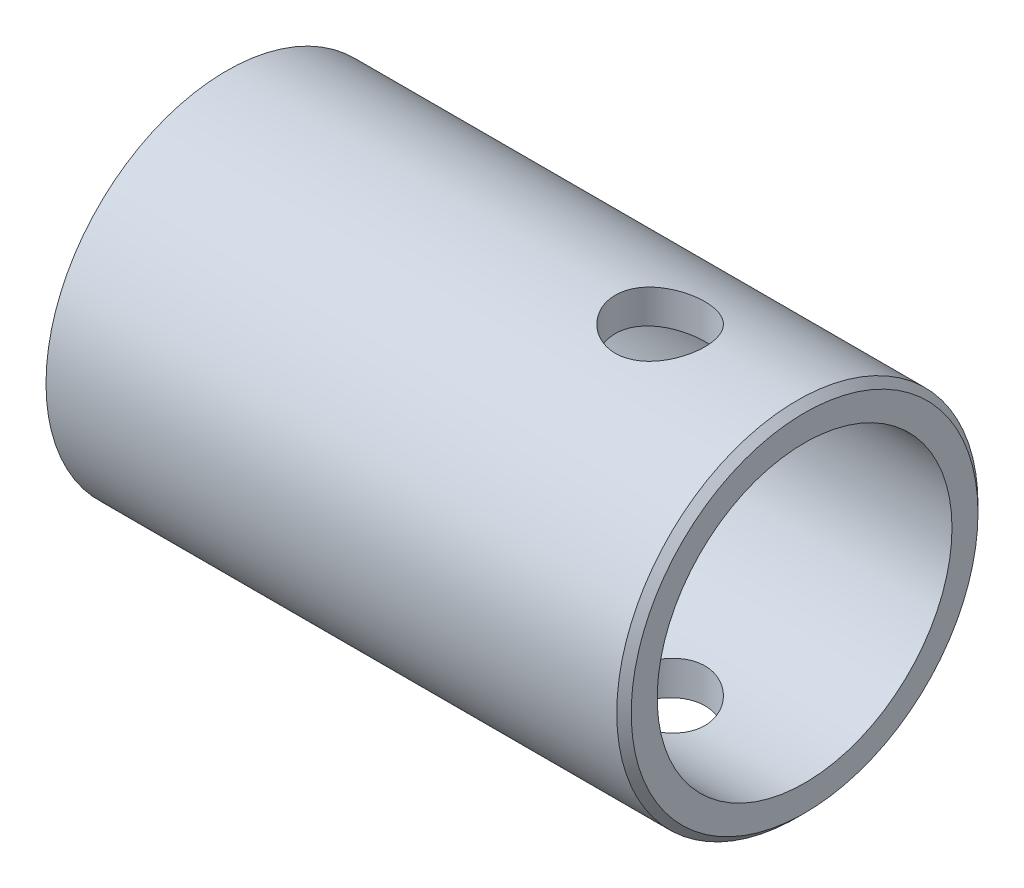
ISO-10303-21;
HEADER;
FILE_DESCRIPTION(('STEP AP214'),'2;1');
FILE_NAME('part.step','',(''),(''),'','','');
FILE_SCHEMA(('AUTOMOTIVE_DESIGN { 1 0 10303 214 1 1 1 1 }'));
ENDSEC;
DATA;
#1=APPLICATION_CONTEXT('core data for automotive mechanical design processes');
#2=APPLICATION_PROTOCOL_DEFINITION('international standard','automotive_design',2000,#1);
#3=PRODUCT_CONTEXT('',#1,'mechanical');
#4=PRODUCT('Part','Part','',(#3));
#5=PRODUCT_RELATED_PRODUCT_CATEGORY('part','',(#4));
#6=PRODUCT_DEFINITION_FORMATION('','',#4);
#7=PRODUCT_DEFINITION_CONTEXT('part definition',#1,'design');
#8=PRODUCT_DEFINITION('design','',#6,#7);
#9=PRODUCT_DEFINITION_SHAPE('','',#8);
#10=(LENGTH_UNIT() NAMED_UNIT(*) SI_UNIT(.MILLI.,.METRE.));
#11=(NAMED_UNIT(*) PLANE_ANGLE_UNIT() SI_UNIT($,.RADIAN.));
#12=(NAMED_UNIT(*) SI_UNIT($,.STERADIAN.) SOLID_ANGLE_UNIT());
#13=UNCERTAINTY_MEASURE_WITH_UNIT(LENGTH_MEASURE(1.E-05),#10,'distance_accuracy_value','');
#14=(GEOMETRIC_REPRESENTATION_CONTEXT(3) GLOBAL_UNCERTAINTY_ASSIGNED_CONTEXT((#13)) GLOBAL_UNIT_ASSIGNED_CONTEXT((#10,
#11,#12)) REPRESENTATION_CONTEXT('',''));
#15=CARTESIAN_POINT('',(0.,0.,0.));
#16=DIRECTION('',(0.,0.,1.));
#17=DIRECTION('',(1.,0.,0.));
#18=AXIS2_PLACEMENT_3D('',#15,#16,#17);
#19=CARTESIAN_POINT('',(30.,0.,0.));
#20=DIRECTION('',(1.,0.,0.));
#21=DIRECTION('',(0.,0.,-1.));
#22=AXIS2_PLACEMENT_3D('',#19,#20,#21);
#23=PLANE('',#22);
#24=CARTESIAN_POINT('',(30.,0.,0.));
#25=DIRECTION('',(1.,0.,0.));
#26=DIRECTION('',(0.,0.,-1.));
#27=AXIS2_PLACEMENT_3D('',#24,#25,#26);
#28=CIRCLE('',#27,12.);
#29=CARTESIAN_POINT('',(30.,0.,-12.));
#30=VERTEX_POINT('',#29);
#31=EDGE_CURVE('E47',#30,#30,#28,.T.);
#32=ORIENTED_EDGE('',*,*,#31,.T.);
#33=EDGE_LOOP('',(#32));
#34=FACE_BOUND('',#33,.T.);
#35=CARTESIAN_POINT('',(30.,0.,0.));
#36=DIRECTION('',(1.,0.,0.));
#37=DIRECTION('',(0.,0.,-1.));
#38=AXIS2_PLACEMENT_3D('',#35,#36,#37);
#39=CIRCLE('',#38,10.2);
#40=CARTESIAN_POINT('',(30.,0.,-10.2));
#41=VERTEX_POINT('',#40);
#42=EDGE_CURVE('E52',#41,#41,#39,.T.);
#43=ORIENTED_EDGE('',*,*,#42,.F.);
#44=EDGE_LOOP('',(#43));
#45=FACE_BOUND('',#44,.T.);
#46=ADVANCED_FACE('F38',(#34,#45),#23,.T.);
#47=CARTESIAN_POINT('',(30.,0.,0.));
#48=DIRECTION('',(-1.,0.,0.));
#49=DIRECTION('',(0.,0.,1.));
#50=AXIS2_PLACEMENT_3D('',#47,#48,#49);
#51=CYLINDRICAL_SURFACE('',#50,12.5);
#52=CARTESIAN_POINT('',(29.5,0.,0.));
#53=DIRECTION('',(1.,0.,0.));
#54=DIRECTION('',(0.,0.,-1.));
#55=AXIS2_PLACEMENT_3D('',#52,#53,#54);
#56=CIRCLE('',#55,12.5);
#57=CARTESIAN_POINT('',(29.5,0.,-12.5));
#58=VERTEX_POINT('',#57);
#59=EDGE_CURVE('E10',#58,#58,#56,.F.);
#60=ORIENTED_EDGE('',*,*,#59,.T.);
#61=EDGE_LOOP('',(#60));
#62=FACE_BOUND('',#61,.T.);
#63=CARTESIAN_POINT('',(20.,-12.1095004025765,3.1));
#64=CARTESIAN_POINT('',(20.171230306462,-12.1095036969281,3.09999505768814));
#65=CARTESIAN_POINT('',(20.3425156024854,-12.113171892604,3.0857646710192));
#66=CARTESIAN_POINT('',(20.680170676613,-12.1274115812828,3.02930792139365));
#67=CARTESIAN_POINT('',(20.8465374867954,-12.1379871569294,2.98706500125337));
#68=CARTESIAN_POINT('',(21.1694227484503,-12.1647718569959,2.87603182358399));
#69=CARTESIAN_POINT('',(21.3259534870951,-12.1809737808694,2.80727548531038));
#70=CARTESIAN_POINT('',(21.6252744434348,-12.2171766879529,2.64527013145648));
#71=CARTESIAN_POINT('',(21.7680641347064,-12.2371778166242,2.55202017802905));
#72=CARTESIAN_POINT('',(22.0389423724172,-12.2792103914624,2.34151763869703));
#73=CARTESIAN_POINT('',(22.1666894652632,-12.3012738533202,2.22383197210292));
#74=CARTESIAN_POINT('',(22.4008492975071,-12.3446671989235,1.96873164115792));
#75=CARTESIAN_POINT('',(22.5072600665424,-12.3659970147677,1.83131515671836));
#76=CARTESIAN_POINT('',(22.6971205269653,-12.4058736259303,1.53831806708502));
#77=CARTESIAN_POINT('',(22.7802352519266,-12.4243782348496,1.38251416735298));
#78=CARTESIAN_POINT('',(22.9189670617538,-12.45615445694,1.05861118609272));
#79=CARTESIAN_POINT('',(22.974588137091,-12.4694268294694,0.890513892914921));
#80=CARTESIAN_POINT('',(23.0556614098036,-12.4890168188816,0.550354880943367));
#81=CARTESIAN_POINT('',(23.0816933268929,-12.4954678979263,0.378439150973423));
#82=CARTESIAN_POINT('',(23.1046685547131,-12.5011533404126,0.0325677497739097));
#83=CARTESIAN_POINT('',(23.1016161002728,-12.5003887544908,-0.141387620789995));
#84=CARTESIAN_POINT('',(23.0669271831509,-12.491828543349,-0.482381309338295));
#85=CARTESIAN_POINT('',(23.035916409909,-12.4841868305697,-0.649487722523164));
#86=CARTESIAN_POINT('',(22.9471962690822,-12.46290994108,-0.976046857571029));
#87=CARTESIAN_POINT('',(22.8894854930732,-12.4492744482,-1.13549917519097));
#88=CARTESIAN_POINT('',(22.7484941549075,-12.4173058251709,-1.44387823753698));
#89=CARTESIAN_POINT('',(22.6649899513674,-12.3989318496651,-1.59269832497694));
#90=CARTESIAN_POINT('',(22.4749515796042,-12.3594808408466,-1.87443320726067));
#91=CARTESIAN_POINT('',(22.3684134618889,-12.3384033442292,-2.00734526836763));
#92=CARTESIAN_POINT('',(22.1319737177313,-12.2951809865875,-2.25722217074307));
#93=CARTESIAN_POINT('',(22.0015252585027,-12.273022649575,-2.37366780241004));
#94=CARTESIAN_POINT('',(21.7227203737036,-12.2306506575257,-2.58314513243327));
#95=CARTESIAN_POINT('',(21.5743631387264,-12.2104370904591,-2.67617577193683));
#96=CARTESIAN_POINT('',(21.2629457870134,-12.1741958121655,-2.83650766352277));
#97=CARTESIAN_POINT('',(21.0998197580579,-12.1581882492215,-2.90368576073025));
#98=CARTESIAN_POINT('',(20.7640969614249,-12.1324310431632,-3.00950411184579));
#99=CARTESIAN_POINT('',(20.5915021920375,-12.1226800851231,-3.0481503624364));
#100=CARTESIAN_POINT('',(20.2465515431067,-12.1108156045406,-3.09495038529759));
#101=CARTESIAN_POINT('',(20.0743061910669,-12.1085100476246,-3.10387104764719));
#102=CARTESIAN_POINT('',(19.7307878888389,-12.1112750116352,-3.09306462115271));
#103=CARTESIAN_POINT('',(19.5595148521278,-12.1163448655851,-3.0733401227621));
#104=CARTESIAN_POINT('',(19.2256385185535,-12.1331055651513,-3.00647524657814));
#105=CARTESIAN_POINT('',(19.062940221908,-12.1446889002202,-2.95977971682027));
#106=CARTESIAN_POINT('',(18.7476802854728,-12.1730696846342,-2.84079072403559));
#107=CARTESIAN_POINT('',(18.5951198341489,-12.1898677439998,-2.76849426606215));
#108=CARTESIAN_POINT('',(18.30121216457,-12.227190762839,-2.59874483399771));
#109=CARTESIAN_POINT('',(18.1601388421621,-12.2477815118928,-2.50083241499443));
#110=CARTESIAN_POINT('',(17.8961431000053,-12.2902076501179,-2.2832127230848));
#111=CARTESIAN_POINT('',(17.7732236192799,-12.312043240032,-2.16350192811128));
#112=CARTESIAN_POINT('',(17.5459270697073,-12.3551483638611,-1.90216739414241));
#113=CARTESIAN_POINT('',(17.44208000408,-12.3763907938598,-1.76007738379077));
#114=CARTESIAN_POINT('',(17.2597213765469,-12.4153600241027,-1.46002997317109));
#115=CARTESIAN_POINT('',(17.1812084989043,-12.433087006904,-1.30207339749569));
#116=CARTESIAN_POINT('',(17.0524231663454,-12.462916765785,-0.975863817826879));
#117=CARTESIAN_POINT('',(17.0019488134661,-12.4750596394128,-0.807694361232425));
#118=CARTESIAN_POINT('',(16.9300652646458,-12.4925284130761,-0.464919820973038));
#119=CARTESIAN_POINT('',(16.9086505547465,-12.4978556063505,-0.290315964671496));
#120=CARTESIAN_POINT('',(16.8958001968035,-12.5010409712553,0.0553885048222954));
#121=CARTESIAN_POINT('',(16.9035817994089,-12.4990941637902,0.226458669550183));
#122=CARTESIAN_POINT('',(16.9471131547232,-12.4883817501128,0.564772935581729));
#123=CARTESIAN_POINT('',(16.9828620997699,-12.4796163408133,0.732017147230613));
#124=CARTESIAN_POINT('',(17.0808963609403,-12.4562807426228,1.05712708868771));
#125=CARTESIAN_POINT('',(17.143042171491,-12.4417410960694,1.21503722032818));
#126=CARTESIAN_POINT('',(17.2919791088261,-12.408389450099,1.5182779557583));
#127=CARTESIAN_POINT('',(17.3787732986025,-12.3895769197597,1.66360699319651));
#128=CARTESIAN_POINT('',(17.5769416310554,-12.349154005666,1.94127913496442));
#129=CARTESIAN_POINT('',(17.6888482080386,-12.3274880062304,2.07323416167502));
#130=CARTESIAN_POINT('',(17.9330282087782,-12.2840533133329,2.31675830908232));
#131=CARTESIAN_POINT('',(18.0653067679012,-12.2622845953226,2.42832227405311));
#132=CARTESIAN_POINT('',(18.3493866550678,-12.2206567681472,2.62989744091099));
#133=CARTESIAN_POINT('',(18.5015006653637,-12.2008398423108,2.71947736424201));
#134=CARTESIAN_POINT('',(18.8190982604266,-12.1659242019711,2.87165936643607));
#135=CARTESIAN_POINT('',(18.9845719000728,-12.1508220177641,2.93428129732557));
#136=CARTESIAN_POINT('',(19.2914904014501,-12.1294359406737,3.02131889679248));
#137=CARTESIAN_POINT('',(19.4314519239201,-12.1220159040622,3.05076054128116));
#138=CARTESIAN_POINT('',(19.7142630261312,-12.1120469610578,3.09010235036591));
#139=CARTESIAN_POINT('',(19.8571123670558,-12.1094976535181,3.10000412424213));
#140=CARTESIAN_POINT('',(20.,-12.1095004025765,3.1));
#141=B_SPLINE_CURVE_WITH_KNOTS('',3,(#63,#64,#65,#66,#67,#68,#69,#70,#71,#72,#73,#74,#75,#76,
#77,#78,#79,#80,#81,#82,#83,#84,#85,#86,#87,#88,#89,#90,#91,#92,#93,#94,#95,#96,#97,#98,#99,
#100,#101,#102,#103,#104,#105,#106,#107,#108,#109,#110,#111,#112,#113,#114,#115,#116,#117,#118,
#119,#120,#121,#122,#123,#124,#125,#126,#127,#128,#129,#130,#131,#132,#133,#134,#135,#136,#137,
#138,#139,#140),.UNSPECIFIED.,.T.,.F.,(4,2,2,2,2,2,2,2,2,2,2,2,2,2,2,2,2,2,2,2,2,2,2,2,2,2,2,2,
2,2,2,2,2,2,2,2,2,2,4),(0.,0.513166266797631,1.02663611807438,1.53945124271708,2.0522860056336,
2.57513332734764,3.09802891064934,3.62809679991228,4.1580877316852,4.67750557333038,
5.19684778631792,5.70484831185399,6.212875637454,6.72543768722411,7.23808769284673,
7.76439579336746,8.29072768986715,8.819536743264,9.34823462252216,9.86318244943826,
10.3780837112355,10.8847255422946,11.391426662876,11.9079264617309,12.4245097880824,
12.9537900115952,13.4830427423909,14.0084333575632,14.5337242678862,15.0450340887744,
15.5563291442148,16.0649550187847,16.573644126689,17.094355393731,17.6151981371013,
18.1455621705257,18.6755349698102,19.1037953309693,19.5320204196499),.UNSPECIFIED.);
#142=CARTESIAN_POINT('',(20.,-12.1095004025765,3.1));
#143=VERTEX_POINT('',#142);
#144=EDGE_CURVE('E98',#143,#143,#141,.T.);
#145=ORIENTED_EDGE('',*,*,#144,.T.);
#146=EDGE_LOOP('',(#145));
#147=FACE_BOUND('',#146,.T.);
#148=CARTESIAN_POINT('',(20.,12.1095004025765,3.1));
#149=CARTESIAN_POINT('',(19.828769693538,12.1095036969281,3.09999505768814));
#150=CARTESIAN_POINT('',(19.6574843975146,12.113171892604,3.0857646710192));
#151=CARTESIAN_POINT('',(19.3198293233869,12.1274115812828,3.02930792139365));
#152=CARTESIAN_POINT('',(19.1534625132046,12.1379871569294,2.98706500125337));
#153=CARTESIAN_POINT('',(18.8305772515497,12.1647718569959,2.87603182358399));
#154=CARTESIAN_POINT('',(18.6740465129049,12.1809737808694,2.80727548531038));
#155=CARTESIAN_POINT('',(18.3747255565652,12.2171766879529,2.64527013145648));
#156=CARTESIAN_POINT('',(18.2319358652936,12.2371778166242,2.55202017802905));
#157=CARTESIAN_POINT('',(17.9610576275828,12.2792103914624,2.34151763869703));
#158=CARTESIAN_POINT('',(17.8333105347368,12.3012738533202,2.22383197210292));
#159=CARTESIAN_POINT('',(17.5991507024929,12.3446671989235,1.96873164115792));
#160=CARTESIAN_POINT('',(17.4927399334576,12.3659970147677,1.83131515671836));
#161=CARTESIAN_POINT('',(17.3028794730347,12.4058736259303,1.53831806708502));
#162=CARTESIAN_POINT('',(17.2197647480734,12.4243782348496,1.38251416735298));
#163=CARTESIAN_POINT('',(17.0810329382462,12.45615445694,1.05861118609272));
#164=CARTESIAN_POINT('',(17.025411862909,12.4694268294694,0.890513892914921));
#165=CARTESIAN_POINT('',(16.9443385901964,12.4890168188816,0.550354880943367));
#166=CARTESIAN_POINT('',(16.9183066731071,12.4954678979263,0.378439150973423));
#167=CARTESIAN_POINT('',(16.8953314452869,12.5011533404126,0.0325677497739097));
#168=CARTESIAN_POINT('',(16.8983838997272,12.5003887544908,-0.141387620789995));
#169=CARTESIAN_POINT('',(16.9330728168491,12.491828543349,-0.482381309338295));
#170=CARTESIAN_POINT('',(16.964083590091,12.4841868305697,-0.649487722523164));
#171=CARTESIAN_POINT('',(17.0528037309178,12.46290994108,-0.976046857571029));
#172=CARTESIAN_POINT('',(17.1105145069268,12.4492744482,-1.13549917519097));
#173=CARTESIAN_POINT('',(17.2515058450925,12.4173058251709,-1.44387823753698));
#174=CARTESIAN_POINT('',(17.3350100486326,12.3989318496651,-1.59269832497694));
#175=CARTESIAN_POINT('',(17.5250484203958,12.3594808408466,-1.87443320726068));
#176=CARTESIAN_POINT('',(17.6315865381111,12.3384033442292,-2.00734526836763));
#177=CARTESIAN_POINT('',(17.8680262822687,12.2951809865875,-2.25722217074307));
#178=CARTESIAN_POINT('',(17.9984747414973,12.273022649575,-2.37366780241004));
#179=CARTESIAN_POINT('',(18.2772796262964,12.2306506575257,-2.58314513243327));
#180=CARTESIAN_POINT('',(18.4256368612736,12.2104370904591,-2.67617577193683));
#181=CARTESIAN_POINT('',(18.7370542129866,12.1741958121655,-2.83650766352277));
#182=CARTESIAN_POINT('',(18.9001802419421,12.1581882492215,-2.90368576073025));
#183=CARTESIAN_POINT('',(19.2359030385751,12.1324310431632,-3.0095041118458));
#184=CARTESIAN_POINT('',(19.4084978079625,12.1226800851231,-3.0481503624364));
#185=CARTESIAN_POINT('',(19.7534484568933,12.1108156045406,-3.09495038529759));
#186=CARTESIAN_POINT('',(19.9256938089331,12.1085100476246,-3.10387104764719));
#187=CARTESIAN_POINT('',(20.2692121111611,12.1112750116352,-3.09306462115271));
#188=CARTESIAN_POINT('',(20.4404851478722,12.1163448655851,-3.0733401227621));
#189=CARTESIAN_POINT('',(20.7743614814465,12.1331055651513,-3.00647524657814));
#190=CARTESIAN_POINT('',(20.937059778092,12.1446889002202,-2.95977971682027));
#191=CARTESIAN_POINT('',(21.2523197145271,12.1730696846342,-2.84079072403559));
#192=CARTESIAN_POINT('',(21.4048801658511,12.1898677439998,-2.76849426606215));
#193=CARTESIAN_POINT('',(21.69878783543,12.227190762839,-2.59874483399771));
#194=CARTESIAN_POINT('',(21.8398611578379,12.2477815118928,-2.50083241499443));
#195=CARTESIAN_POINT('',(22.1038568999947,12.2902076501179,-2.2832127230848));
#196=CARTESIAN_POINT('',(22.2267763807201,12.312043240032,-2.16350192811128));
#197=CARTESIAN_POINT('',(22.4540729302927,12.3551483638611,-1.90216739414241));
#198=CARTESIAN_POINT('',(22.55791999592,12.3763907938598,-1.76007738379077));
#199=CARTESIAN_POINT('',(22.7402786234531,12.4153600241027,-1.46002997317109));
#200=CARTESIAN_POINT('',(22.8187915010957,12.433087006904,-1.30207339749569));
#201=CARTESIAN_POINT('',(22.9475768336546,12.462916765785,-0.975863817826879));
#202=CARTESIAN_POINT('',(22.9980511865339,12.4750596394128,-0.807694361232425));
#203=CARTESIAN_POINT('',(23.0699347353542,12.4925284130761,-0.464919820973038));
#204=CARTESIAN_POINT('',(23.0913494452535,12.4978556063505,-0.290315964671496));
#205=CARTESIAN_POINT('',(23.1041998031965,12.5010409712553,0.0553885048222954));
#206=CARTESIAN_POINT('',(23.0964182005911,12.4990941637902,0.226458669550183));
#207=CARTESIAN_POINT('',(23.0528868452768,12.4883817501128,0.564772935581729));
#208=CARTESIAN_POINT('',(23.0171379002301,12.4796163408133,0.732017147230613));
#209=CARTESIAN_POINT('',(22.9191036390597,12.4562807426228,1.05712708868771));
#210=CARTESIAN_POINT('',(22.856957828509,12.4417410960694,1.21503722032818));
#211=CARTESIAN_POINT('',(22.7080208911739,12.408389450099,1.5182779557583));
#212=CARTESIAN_POINT('',(22.6212267013975,12.3895769197597,1.66360699319651));
#213=CARTESIAN_POINT('',(22.4230583689446,12.349154005666,1.94127913496442));
#214=CARTESIAN_POINT('',(22.3111517919614,12.3274880062304,2.07323416167502));
#215=CARTESIAN_POINT('',(22.0669717912218,12.2840533133329,2.31675830908232));
#216=CARTESIAN_POINT('',(21.9346932320988,12.2622845953226,2.42832227405311));
#217=CARTESIAN_POINT('',(21.6506133449322,12.2206567681472,2.62989744091099));
#218=CARTESIAN_POINT('',(21.4984993346363,12.2008398423108,2.71947736424201));
#219=CARTESIAN_POINT('',(21.1809017395734,12.1659242019711,2.87165936643607));
#220=CARTESIAN_POINT('',(21.0154280999272,12.1508220177641,2.93428129732557));
#221=CARTESIAN_POINT('',(20.7085095985499,12.1294359406737,3.02131889679248));
#222=CARTESIAN_POINT('',(20.5685480760799,12.1220159040622,3.05076054128116));
#223=CARTESIAN_POINT('',(20.2857369738688,12.1120469610578,3.09010235036591));
#224=CARTESIAN_POINT('',(20.1428876329442,12.1094976535181,3.10000412424213));
#225=CARTESIAN_POINT('',(20.,12.1095004025765,3.1));
#226=B_SPLINE_CURVE_WITH_KNOTS('',3,(#148,#149,#150,#151,#152,#153,#154,#155,#156,#157,#158,
#159,#160,#161,#162,#163,#164,#165,#166,#167,#168,#169,#170,#171,#172,#173,#174,#175,#176,#177,
#178,#179,#180,#181,#182,#183,#184,#185,#186,#187,#188,#189,#190,#191,#192,#193,#194,#195,#196,
#197,#198,#199,#200,#201,#202,#203,#204,#205,#206,#207,#208,#209,#210,#211,#212,#213,#214,#215,
#216,#217,#218,#219,#220,#221,#222,#223,#224,#225),.UNSPECIFIED.,.T.,.F.,(4,2,2,2,2,2,2,2,2,2,2,
2,2,2,2,2,2,2,2,2,2,2,2,2,2,2,2,2,2,2,2,2,2,2,2,2,2,2,4),(0.,0.513166266797631,1.02663611807438,
1.53945124271708,2.0522860056336,2.57513332734764,3.09802891064934,3.62809679991228,
4.1580877316852,4.67750557333038,5.19684778631792,5.70484831185399,6.212875637454,
6.72543768722411,7.23808769284673,7.76439579336746,8.29072768986715,8.81953674326401,
9.34823462252216,9.86318244943826,10.3780837112355,10.8847255422946,11.391426662876,
11.9079264617309,12.4245097880824,12.9537900115952,13.4830427423909,14.0084333575632,
14.5337242678862,15.0450340887744,15.5563291442148,16.0649550187847,16.573644126689,
17.094355393731,17.6151981371013,18.1455621705257,18.6755349698102,19.1037953309693,
19.5320204196499),.UNSPECIFIED.);
#227=CARTESIAN_POINT('',(20.,12.1095004025765,3.1));
#228=VERTEX_POINT('',#227);
#229=EDGE_CURVE('E69',#228,#228,#226,.T.);
#230=ORIENTED_EDGE('',*,*,#229,.T.);
#231=EDGE_LOOP('',(#230));
#232=FACE_BOUND('',#231,.T.);
#233=CARTESIAN_POINT('',(-10.,0.,0.));
#234=DIRECTION('',(-1.,0.,0.));
#235=DIRECTION('',(0.,0.,1.));
#236=AXIS2_PLACEMENT_3D('',#233,#234,#235);
#237=CIRCLE('',#236,12.5);
#238=CARTESIAN_POINT('',(-10.,0.,12.5));
#239=VERTEX_POINT('',#238);
#240=EDGE_CURVE('E57',#239,#239,#237,.T.);
#241=ORIENTED_EDGE('',*,*,#240,.F.);
#242=EDGE_LOOP('',(#241));
#243=FACE_BOUND('',#242,.T.);
#244=ADVANCED_FACE('F105',(#62,#147,#232,#243),#51,.T.);
#245=CARTESIAN_POINT('',(30.,0.,0.));
#246=DIRECTION('',(-1.,0.,0.));
#247=DIRECTION('',(0.,0.,1.));
#248=AXIS2_PLACEMENT_3D('',#245,#246,#247);
#249=CYLINDRICAL_SURFACE('',#248,10.2);
#250=CARTESIAN_POINT('',(20.,-9.71750996912275,3.1));
#251=CARTESIAN_POINT('',(20.1697549784958,-9.71751152044069,3.09999817405107));
#252=CARTESIAN_POINT('',(20.3395280228383,-9.72200681201951,3.08600901394495));
#253=CARTESIAN_POINT('',(20.6741031344128,-9.73942808103335,3.03057106714479));
#254=CARTESIAN_POINT('',(20.838903623304,-9.75235670644731,2.98911365564171));
#255=CARTESIAN_POINT('',(21.1586408369505,-9.78504803212674,2.88028292198344));
#256=CARTESIAN_POINT('',(21.3135937736497,-9.80479913636959,2.81295355215432));
#257=CARTESIAN_POINT('',(21.610044285967,-9.84889414240463,2.65443526710116));
#258=CARTESIAN_POINT('',(21.7515397283202,-9.87323877053737,2.56324257766043));
#259=CARTESIAN_POINT('',(22.021655010182,-9.92466471031361,2.35641449228445));
#260=CARTESIAN_POINT('',(22.1497731968717,-9.95180548758248,2.24013857784791));
#261=CARTESIAN_POINT('',(22.3850249490969,-10.005258279883,1.98781669350988));
#262=CARTESIAN_POINT('',(22.492155746569,-10.0315701852097,1.85176811987424));
#263=CARTESIAN_POINT('',(22.6845809666634,-10.0810775315666,1.56018293657678));
#264=CARTESIAN_POINT('',(22.7693623083845,-10.1041947568644,1.40429328666227));
#265=CARTESIAN_POINT('',(22.9113103491299,-10.1440160742436,1.07964676222009));
#266=CARTESIAN_POINT('',(22.9684831687785,-10.1607215875898,0.910892749249633));
#267=CARTESIAN_POINT('',(23.0519265088604,-10.1854164163053,0.570557381789036));
#268=CARTESIAN_POINT('',(23.0790536571584,-10.1936468513655,0.39920386796128));
#269=CARTESIAN_POINT('',(23.1043459838402,-10.2013140734623,0.0541931829084895));
#270=CARTESIAN_POINT('',(23.1025174001275,-10.2007527544977,-0.119463484096522));
#271=CARTESIAN_POINT('',(23.0705216115078,-10.1910693627075,-0.45813532073202));
#272=CARTESIAN_POINT('',(23.0412823611548,-10.1822276232319,-0.623247442175159));
#273=CARTESIAN_POINT('',(22.9568131548176,-10.1573188275363,-0.946099613824699));
#274=CARTESIAN_POINT('',(22.9015815367367,-10.1412513092627,-1.10383919188042));
#275=CARTESIAN_POINT('',(22.7660770819901,-10.1033122578068,-1.40965435486965));
#276=CARTESIAN_POINT('',(22.6855155857759,-10.0813742771303,-1.55759345374657));
#277=CARTESIAN_POINT('',(22.5018675477222,-10.0340164420241,-1.83814744235965));
#278=CARTESIAN_POINT('',(22.3987755508266,-10.0085957449207,-1.97075860900771));
#279=CARTESIAN_POINT('',(22.1681951822428,-9.95580268410267,-2.22242892081083));
#280=CARTESIAN_POINT('',(22.0399036919551,-9.92839289329177,-2.34074539451154));
#281=CARTESIAN_POINT('',(21.7650364091201,-9.87558572669924,-2.55439820171712));
#282=CARTESIAN_POINT('',(21.6184587010576,-9.85018856220037,-2.64973212468498));
#283=CARTESIAN_POINT('',(21.309180244082,-9.8041002409542,-2.81551563282124));
#284=CARTESIAN_POINT('',(21.1463320116686,-9.78345904441839,-2.88570498944211));
#285=CARTESIAN_POINT('',(20.8103521496063,-9.74981034050356,-2.99743933215379));
#286=CARTESIAN_POINT('',(20.6372240003385,-9.73680026556839,-3.03899395346984));
#287=CARTESIAN_POINT('',(20.2926816992384,-9.7204523589455,-3.0908772547888));
#288=CARTESIAN_POINT('',(20.1214544328166,-9.71676424006692,-3.10233745629306));
#289=CARTESIAN_POINT('',(19.7795164490988,-9.71850799272476,-3.09687162522217));
#290=CARTESIAN_POINT('',(19.6088056607725,-9.72393854720213,-3.07994969203184));
#291=CARTESIAN_POINT('',(19.2775128682104,-9.74296332767579,-3.01920875619412));
#292=CARTESIAN_POINT('',(19.1167819511098,-9.75633422980107,-2.97612484394311));
#293=CARTESIAN_POINT('',(18.8048433824241,-9.78950014170735,-2.86513861093794));
#294=CARTESIAN_POINT('',(18.6536372317492,-9.80929616094788,-2.79723239010285));
#295=CARTESIAN_POINT('',(18.360454979287,-9.85375620540459,-2.63640131889929));
#296=CARTESIAN_POINT('',(18.2188455938166,-9.87853881529002,-2.54284158263212));
#297=CARTESIAN_POINT('',(17.9529237111522,-9.92992781491067,-2.33410928364216));
#298=CARTESIAN_POINT('',(17.8286154769138,-9.95653465172834,-2.21893141063124));
#299=CARTESIAN_POINT('',(17.5958430227318,-10.0098260484167,-1.96490204351709));
#300=CARTESIAN_POINT('',(17.4881826997431,-10.0364734121133,-1.82530424513182));
#301=CARTESIAN_POINT('',(17.2977923950404,-10.0858041855733,-1.52938564942507));
#302=CARTESIAN_POINT('',(17.2150612011926,-10.108487788045,-1.3730656656906));
#303=CARTESIAN_POINT('',(17.0776755344579,-10.147199166401,-1.04915396951939));
#304=CARTESIAN_POINT('',(17.0228129434897,-10.1632761018927,-0.88165670378601));
#305=CARTESIAN_POINT('',(16.94220181906,-10.1871795891735,-0.53924202450887));
#306=CARTESIAN_POINT('',(16.916444715368,-10.195008569561,-0.364326810958116));
#307=CARTESIAN_POINT('',(16.8954413409422,-10.2013821230789,-0.0194614478171849));
#308=CARTESIAN_POINT('',(16.8990307210761,-10.2002810199824,0.150412109609826));
#309=CARTESIAN_POINT('',(16.9338249831442,-10.1897574489741,0.487029052736545));
#310=CARTESIAN_POINT('',(16.9650282279009,-10.1803354743921,0.653772623409167));
#311=CARTESIAN_POINT('',(17.0534372418891,-10.1543333132044,0.9775605805363));
#312=CARTESIAN_POINT('',(17.1103459173919,-10.1378350190092,1.13469311646604));
#313=CARTESIAN_POINT('',(17.2482838974718,-10.0993845917701,1.43725992323385));
#314=CARTESIAN_POINT('',(17.329317223137,-10.0774315496317,1.58269223874625));
#315=CARTESIAN_POINT('',(17.5162654344467,-10.0294829537495,1.86288624651997));
#316=CARTESIAN_POINT('',(17.6229054699323,-10.0033789276274,1.99714538316468));
#317=CARTESIAN_POINT('',(17.8567424857222,-9.95040724486369,2.24625153460547));
#318=CARTESIAN_POINT('',(17.9839454573027,-9.92353936755032,2.36109287176285));
#319=CARTESIAN_POINT('',(18.2600014212527,-9.87110435373929,2.57166419856939));
#320=CARTESIAN_POINT('',(18.4094009081523,-9.84560284157931,2.6666959638801));
#321=CARTESIAN_POINT('',(18.7228016470292,-9.79986132175625,2.83018841200398));
#322=CARTESIAN_POINT('',(18.8867961782985,-9.77961890904759,2.89866124760288));
#323=CARTESIAN_POINT('',(19.2076923698018,-9.74858345429048,3.00128316633865));
#324=CARTESIAN_POINT('',(19.3636407182553,-9.73704318175158,3.03819792227743));
#325=CARTESIAN_POINT('',(19.6797212865533,-9.72150651435692,3.08755458260381));
#326=CARTESIAN_POINT('',(19.8398526038876,-9.71750850560438,3.10000172260613));
#327=CARTESIAN_POINT('',(20.,-9.71750996912275,3.1));
#328=B_SPLINE_CURVE_WITH_KNOTS('',3,(#250,#251,#252,#253,#254,#255,#256,#257,#258,#259,#260,
#261,#262,#263,#264,#265,#266,#267,#268,#269,#270,#271,#272,#273,#274,#275,#276,#277,#278,#279,
#280,#281,#282,#283,#284,#285,#286,#287,#288,#289,#290,#291,#292,#293,#294,#295,#296,#297,#298,
#299,#300,#301,#302,#303,#304,#305,#306,#307,#308,#309,#310,#311,#312,#313,#314,#315,#316,#317,
#318,#319,#320,#321,#322,#323,#324,#325,#326,#327),.UNSPECIFIED.,.T.,.F.,(4,2,2,2,2,2,2,2,2,2,2,
2,2,2,2,2,2,2,2,2,2,2,2,2,2,2,2,2,2,2,2,2,2,2,2,2,2,2,4),(0.,0.508673923489766,1.01750764222181,
1.5254807283502,2.03353420398484,2.55654379281369,3.07962231591459,3.61382976824119,
4.14791873592496,4.66635360874124,5.1846767971874,5.68606308682019,6.18748144224144,
6.69483477824863,7.20231109035254,7.72984243161905,8.25742907924015,8.79032805081104,
9.32304762096162,9.83543005156786,10.3477384823882,10.846278448659,11.3448967792182,
11.857185604172,12.3696004330476,12.9019373597178,13.4342483982882,13.9625235274308,
14.49064306322,14.9979137697689,15.5051544031428,16.0066768759045,16.5082829890964,
17.0262447880098,17.5443577746761,18.0784415355625,18.6122806222767,19.0922679675325,
19.5721525932384),.UNSPECIFIED.);
#329=CARTESIAN_POINT('',(20.,-9.71750996912275,3.1));
#330=VERTEX_POINT('',#329);
#331=EDGE_CURVE('E60',#330,#330,#328,.T.);
#332=ORIENTED_EDGE('',*,*,#331,.F.);
#333=EDGE_LOOP('',(#332));
#334=FACE_BOUND('',#333,.T.);
#335=CARTESIAN_POINT('',(20.,9.71750996912275,3.1));
#336=CARTESIAN_POINT('',(19.8302450215042,9.71751152044069,3.09999817405107));
#337=CARTESIAN_POINT('',(19.6604719771617,9.72200681201951,3.08600901394495));
#338=CARTESIAN_POINT('',(19.3258968655872,9.73942808103335,3.03057106714479));
#339=CARTESIAN_POINT('',(19.161096376696,9.75235670644731,2.98911365564171));
#340=CARTESIAN_POINT('',(18.8413591630495,9.78504803212674,2.88028292198344));
#341=CARTESIAN_POINT('',(18.6864062263503,9.80479913636959,2.81295355215432));
#342=CARTESIAN_POINT('',(18.389955714033,9.84889414240463,2.65443526710116));
#343=CARTESIAN_POINT('',(18.2484602716798,9.87323877053737,2.56324257766043));
#344=CARTESIAN_POINT('',(17.978344989818,9.92466471031361,2.35641449228445));
#345=CARTESIAN_POINT('',(17.8502268031283,9.95180548758248,2.24013857784791));
#346=CARTESIAN_POINT('',(17.6149750509031,10.005258279883,1.98781669350988));
#347=CARTESIAN_POINT('',(17.507844253431,10.0315701852097,1.85176811987424));
#348=CARTESIAN_POINT('',(17.3154190333366,10.0810775315666,1.56018293657678));
#349=CARTESIAN_POINT('',(17.2306376916155,10.1041947568644,1.40429328666227));
#350=CARTESIAN_POINT('',(17.0886896508701,10.1440160742436,1.07964676222009));
#351=CARTESIAN_POINT('',(17.0315168312215,10.1607215875898,0.910892749249634));
#352=CARTESIAN_POINT('',(16.9480734911396,10.1854164163053,0.570557381789035));
#353=CARTESIAN_POINT('',(16.9209463428416,10.1936468513655,0.399203867961279));
#354=CARTESIAN_POINT('',(16.8956540161598,10.2013140734623,0.0541931829084894));
#355=CARTESIAN_POINT('',(16.8974825998725,10.2007527544977,-0.119463484096522));
#356=CARTESIAN_POINT('',(16.9294783884922,10.1910693627075,-0.45813532073202));
#357=CARTESIAN_POINT('',(16.9587176388452,10.1822276232319,-0.623247442175159));
#358=CARTESIAN_POINT('',(17.0431868451824,10.1573188275363,-0.946099613824699));
#359=CARTESIAN_POINT('',(17.0984184632633,10.1412513092627,-1.10383919188042));
#360=CARTESIAN_POINT('',(17.2339229180099,10.1033122578068,-1.40965435486965));
#361=CARTESIAN_POINT('',(17.3144844142241,10.0813742771303,-1.55759345374657));
#362=CARTESIAN_POINT('',(17.4981324522778,10.0340164420241,-1.83814744235965));
#363=CARTESIAN_POINT('',(17.6012244491734,10.0085957449207,-1.97075860900771));
#364=CARTESIAN_POINT('',(17.8318048177572,9.95580268410267,-2.22242892081083));
#365=CARTESIAN_POINT('',(17.9600963080449,9.92839289329177,-2.34074539451154));
#366=CARTESIAN_POINT('',(18.2349635908799,9.87558572669924,-2.55439820171712));
#367=CARTESIAN_POINT('',(18.3815412989424,9.85018856220037,-2.64973212468498));
#368=CARTESIAN_POINT('',(18.690819755918,9.8041002409542,-2.81551563282124));
#369=CARTESIAN_POINT('',(18.8536679883314,9.78345904441839,-2.88570498944211));
#370=CARTESIAN_POINT('',(19.1896478503937,9.74981034050356,-2.99743933215379));
#371=CARTESIAN_POINT('',(19.3627759996615,9.73680026556839,-3.03899395346984));
#372=CARTESIAN_POINT('',(19.7073183007616,9.7204523589455,-3.0908772547888));
#373=CARTESIAN_POINT('',(19.8785455671833,9.71676424006692,-3.10233745629306));
#374=CARTESIAN_POINT('',(20.2204835509012,9.71850799272476,-3.09687162522217));
#375=CARTESIAN_POINT('',(20.3911943392274,9.72393854720213,-3.07994969203184));
#376=CARTESIAN_POINT('',(20.7224871317896,9.74296332767579,-3.01920875619412));
#377=CARTESIAN_POINT('',(20.8832180488902,9.75633422980107,-2.97612484394311));
#378=CARTESIAN_POINT('',(21.1951566175759,9.78950014170735,-2.86513861093794));
#379=CARTESIAN_POINT('',(21.3463627682508,9.80929616094788,-2.79723239010285));
#380=CARTESIAN_POINT('',(21.639545020713,9.85375620540459,-2.63640131889929));
#381=CARTESIAN_POINT('',(21.7811544061834,9.87853881529002,-2.54284158263212));
#382=CARTESIAN_POINT('',(22.0470762888478,9.92992781491067,-2.33410928364216));
#383=CARTESIAN_POINT('',(22.1713845230862,9.95653465172834,-2.21893141063124));
#384=CARTESIAN_POINT('',(22.4041569772682,10.0098260484167,-1.96490204351709));
#385=CARTESIAN_POINT('',(22.5118173002569,10.0364734121133,-1.82530424513182));
#386=CARTESIAN_POINT('',(22.7022076049596,10.0858041855733,-1.52938564942507));
#387=CARTESIAN_POINT('',(22.7849387988074,10.108487788045,-1.3730656656906));
#388=CARTESIAN_POINT('',(22.9223244655421,10.147199166401,-1.04915396951939));
#389=CARTESIAN_POINT('',(22.9771870565103,10.1632761018927,-0.88165670378601));
#390=CARTESIAN_POINT('',(23.05779818094,10.1871795891735,-0.539242024508869));
#391=CARTESIAN_POINT('',(23.083555284632,10.195008569561,-0.364326810958116));
#392=CARTESIAN_POINT('',(23.1045586590578,10.2013821230789,-0.0194614478171848));
#393=CARTESIAN_POINT('',(23.1009692789239,10.2002810199824,0.150412109609826));
#394=CARTESIAN_POINT('',(23.0661750168558,10.1897574489741,0.487029052736545));
#395=CARTESIAN_POINT('',(23.0349717720991,10.1803354743921,0.653772623409167));
#396=CARTESIAN_POINT('',(22.9465627581109,10.1543333132044,0.9775605805363));
#397=CARTESIAN_POINT('',(22.8896540826081,10.1378350190092,1.13469311646604));
#398=CARTESIAN_POINT('',(22.7517161025281,10.0993845917701,1.43725992323385));
#399=CARTESIAN_POINT('',(22.670682776863,10.0774315496317,1.58269223874625));
#400=CARTESIAN_POINT('',(22.4837345655533,10.0294829537495,1.86288624651997));
#401=CARTESIAN_POINT('',(22.3770945300677,10.0033789276274,1.99714538316468));
#402=CARTESIAN_POINT('',(22.1432575142778,9.95040724486369,2.24625153460547));
#403=CARTESIAN_POINT('',(22.0160545426973,9.92353936755032,2.36109287176285));
#404=CARTESIAN_POINT('',(21.7399985787473,9.87110435373929,2.5716641985694));
#405=CARTESIAN_POINT('',(21.5905990918477,9.84560284157931,2.6666959638801));
#406=CARTESIAN_POINT('',(21.2771983529708,9.79986132175625,2.83018841200398));
#407=CARTESIAN_POINT('',(21.1132038217015,9.77961890904759,2.89866124760288));
#408=CARTESIAN_POINT('',(20.7923076301982,9.74858345429048,3.00128316633865));
#409=CARTESIAN_POINT('',(20.6363592817447,9.73704318175158,3.03819792227743));
#410=CARTESIAN_POINT('',(20.3202787134467,9.72150651435692,3.08755458260381));
#411=CARTESIAN_POINT('',(20.1601473961124,9.71750850560438,3.10000172260613));
#412=CARTESIAN_POINT('',(20.,9.71750996912275,3.1));
#413=B_SPLINE_CURVE_WITH_KNOTS('',3,(#335,#336,#337,#338,#339,#340,#341,#342,#343,#344,#345,
#346,#347,#348,#349,#350,#351,#352,#353,#354,#355,#356,#357,#358,#359,#360,#361,#362,#363,#364,
#365,#366,#367,#368,#369,#370,#371,#372,#373,#374,#375,#376,#377,#378,#379,#380,#381,#382,#383,
#384,#385,#386,#387,#388,#389,#390,#391,#392,#393,#394,#395,#396,#397,#398,#399,#400,#401,#402,
#403,#404,#405,#406,#407,#408,#409,#410,#411,#412),.UNSPECIFIED.,.T.,.F.,(4,2,2,2,2,2,2,2,2,2,2,
2,2,2,2,2,2,2,2,2,2,2,2,2,2,2,2,2,2,2,2,2,2,2,2,2,2,2,4),(0.,0.508673923489766,1.01750764222181,
1.5254807283502,2.03353420398484,2.55654379281369,3.07962231591459,3.61382976824119,
4.14791873592496,4.66635360874124,5.1846767971874,5.68606308682019,6.18748144224144,
6.69483477824863,7.20231109035254,7.72984243161905,8.25742907924015,8.79032805081104,
9.32304762096162,9.83543005156786,10.3477384823882,10.846278448659,11.3448967792182,
11.857185604172,12.3696004330476,12.9019373597178,13.4342483982882,13.9625235274308,
14.49064306322,14.9979137697689,15.5051544031428,16.0066768759045,16.5082829890964,
17.0262447880098,17.5443577746761,18.0784415355625,18.6122806222767,19.0922679675325,
19.5721525932384),.UNSPECIFIED.);
#414=CARTESIAN_POINT('',(20.,9.71750996912275,3.1));
#415=VERTEX_POINT('',#414);
#416=EDGE_CURVE('E70',#415,#415,#413,.T.);
#417=ORIENTED_EDGE('',*,*,#416,.F.);
#418=EDGE_LOOP('',(#417));
#419=FACE_BOUND('',#418,.T.);
#420=ORIENTED_EDGE('',*,*,#42,.T.);
#421=EDGE_LOOP('',(#420));
#422=FACE_BOUND('',#421,.T.);
#423=CARTESIAN_POINT('',(-1.,0.,0.));
#424=DIRECTION('',(1.,0.,0.));
#425=DIRECTION('',(0.,0.,-1.));
#426=AXIS2_PLACEMENT_3D('',#423,#424,#425);
#427=CIRCLE('',#426,10.2);
#428=CARTESIAN_POINT('',(-1.,0.,-10.2));
#429=VERTEX_POINT('',#428);
#430=EDGE_CURVE('E99',#429,#429,#427,.T.);
#431=ORIENTED_EDGE('',*,*,#430,.F.);
#432=EDGE_LOOP('',(#431));
#433=FACE_BOUND('',#432,.T.);
#434=ADVANCED_FACE('F74',(#334,#419,#422,#433),#249,.F.);
#435=CARTESIAN_POINT('',(-10.,0.,0.));
#436=DIRECTION('',(-1.,0.,0.));
#437=DIRECTION('',(0.,0.,1.));
#438=AXIS2_PLACEMENT_3D('',#435,#436,#437);
#439=PLANE('',#438);
#440=CARTESIAN_POINT('',(-10.,0.,9.53));
#441=DIRECTION('',(-1.,0.,0.));
#442=DIRECTION('',(0.,0.,1.));
#443=AXIS2_PLACEMENT_3D('',#440,#441,#442);
#444=CIRCLE('',#443,1.05);
#445=CARTESIAN_POINT('',(-10.,0.,10.58));
#446=VERTEX_POINT('',#445);
#447=EDGE_CURVE('E127',#446,#446,#444,.T.);
#448=ORIENTED_EDGE('',*,*,#447,.F.);
#449=EDGE_LOOP('',(#448));
#450=FACE_BOUND('',#449,.T.);
#451=CARTESIAN_POINT('',(-10.,8.2532220980657,4.765));
#452=DIRECTION('',(-1.,0.,0.));
#453=DIRECTION('',(0.,0.,1.));
#454=AXIS2_PLACEMENT_3D('',#451,#452,#453);
#455=CIRCLE('',#454,1.05);
#456=CARTESIAN_POINT('',(-10.,8.2532220980657,5.815));
#457=VERTEX_POINT('',#456);
#458=EDGE_CURVE('E141',#457,#457,#455,.T.);
#459=ORIENTED_EDGE('',*,*,#458,.F.);
#460=EDGE_LOOP('',(#459));
#461=FACE_BOUND('',#460,.T.);
#462=CARTESIAN_POINT('',(-10.,8.2532220980657,-4.765));
#463=DIRECTION('',(-1.,0.,0.));
#464=DIRECTION('',(0.,0.,1.));
#465=AXIS2_PLACEMENT_3D('',#462,#463,#464);
#466=CIRCLE('',#465,1.05);
#467=CARTESIAN_POINT('',(-10.,8.2532220980657,-3.715));
#468=VERTEX_POINT('',#467);
#469=EDGE_CURVE('E140',#468,#468,#466,.T.);
#470=ORIENTED_EDGE('',*,*,#469,.F.);
#471=EDGE_LOOP('',(#470));
#472=FACE_BOUND('',#471,.T.);
#473=CARTESIAN_POINT('',(-10.,0.,-9.53));
#474=DIRECTION('',(-1.,0.,0.));
#475=DIRECTION('',(0.,0.,1.));
#476=AXIS2_PLACEMENT_3D('',#473,#474,#475);
#477=CIRCLE('',#476,1.05);
#478=CARTESIAN_POINT('',(-10.,0.,-8.48));
#479=VERTEX_POINT('',#478);
#480=EDGE_CURVE('E164',#479,#479,#477,.T.);
#481=ORIENTED_EDGE('',*,*,#480,.F.);
#482=EDGE_LOOP('',(#481));
#483=FACE_BOUND('',#482,.T.);
#484=CARTESIAN_POINT('',(-10.,-8.2532220980657,-4.765));
#485=DIRECTION('',(-1.,0.,0.));
#486=DIRECTION('',(0.,0.,1.));
#487=AXIS2_PLACEMENT_3D('',#484,#485,#486);
#488=CIRCLE('',#487,1.05);
#489=CARTESIAN_POINT('',(-10.,-8.2532220980657,-3.715));
#490=VERTEX_POINT('',#489);
#491=EDGE_CURVE('E156',#490,#490,#488,.T.);
#492=ORIENTED_EDGE('',*,*,#491,.F.);
#493=EDGE_LOOP('',(#492));
#494=FACE_BOUND('',#493,.T.);
#495=CARTESIAN_POINT('',(-10.,-8.2532220980657,4.765));
#496=DIRECTION('',(-1.,0.,0.));
#497=DIRECTION('',(0.,0.,1.));
#498=AXIS2_PLACEMENT_3D('',#495,#496,#497);
#499=CIRCLE('',#498,1.05);
#500=CARTESIAN_POINT('',(-10.,-8.2532220980657,5.815));
#501=VERTEX_POINT('',#500);
#502=EDGE_CURVE('E148',#501,#501,#499,.T.);
#503=ORIENTED_EDGE('',*,*,#502,.F.);
#504=EDGE_LOOP('',(#503));
#505=FACE_BOUND('',#504,.T.);
#506=ORIENTED_EDGE('',*,*,#240,.T.);
#507=EDGE_LOOP('',(#506));
#508=FACE_BOUND('',#507,.T.);
#509=ADVANCED_FACE('F86',(#450,#461,#472,#483,#494,#505,#508),#439,.T.);
#510=CARTESIAN_POINT('',(20.,-15.,0.));
#511=DIRECTION('',(0.,1.,0.));
#512=DIRECTION('',(0.,0.,1.));
#513=AXIS2_PLACEMENT_3D('',#510,#511,#512);
#514=CYLINDRICAL_SURFACE('',#513,3.1);
#515=ORIENTED_EDGE('',*,*,#416,.T.);
#516=EDGE_LOOP('',(#515));
#517=FACE_BOUND('',#516,.T.);
#518=ORIENTED_EDGE('',*,*,#229,.F.);
#519=EDGE_LOOP('',(#518));
#520=FACE_BOUND('',#519,.T.);
#521=ADVANCED_FACE('F82',(#517,#520),#514,.F.);
#522=ORIENTED_EDGE('',*,*,#331,.T.);
#523=EDGE_LOOP('',(#522));
#524=FACE_BOUND('',#523,.T.);
#525=ORIENTED_EDGE('',*,*,#144,.F.);
#526=EDGE_LOOP('',(#525));
#527=FACE_BOUND('',#526,.T.);
#528=ADVANCED_FACE('F78',(#524,#527),#514,.F.);
#529=CARTESIAN_POINT('',(30.,0.,0.));
#530=DIRECTION('',(-1.,0.,0.));
#531=DIRECTION('',(0.,0.,1.));
#532=AXIS2_PLACEMENT_3D('',#529,#530,#531);
#533=CONICAL_SURFACE('',#532,12.,0.785398163397445);
#534=ORIENTED_EDGE('',*,*,#59,.F.);
#535=EDGE_LOOP('',(#534));
#536=FACE_BOUND('',#535,.T.);
#537=ORIENTED_EDGE('',*,*,#31,.F.);
#538=EDGE_LOOP('',(#537));
#539=FACE_BOUND('',#538,.T.);
#540=ADVANCED_FACE('F41',(#536,#539),#533,.T.);
#541=CARTESIAN_POINT('',(-1.,0.,0.));
#542=DIRECTION('',(1.,0.,0.));
#543=DIRECTION('',(0.,0.,-1.));
#544=AXIS2_PLACEMENT_3D('',#541,#542,#543);
#545=PLANE('',#544);
#546=ORIENTED_EDGE('',*,*,#430,.T.);
#547=EDGE_LOOP('',(#546));
#548=FACE_BOUND('',#547,.T.);
#549=ADVANCED_FACE('F84',(#548),#545,.T.);
#550=CARTESIAN_POINT('',(-4.,-8.2532220980657,4.765));
#551=DIRECTION('',(-1.,0.,0.));
#552=DIRECTION('',(0.,0.,1.));
#553=AXIS2_PLACEMENT_3D('',#550,#551,#552);
#554=CYLINDRICAL_SURFACE('',#553,1.05);
#555=CARTESIAN_POINT('',(-4.,-8.2532220980657,4.765));
#556=DIRECTION('',(-1.,0.,0.));
#557=DIRECTION('',(0.,0.,1.));
#558=AXIS2_PLACEMENT_3D('',#555,#556,#557);
#559=CIRCLE('',#558,1.05);
#560=CARTESIAN_POINT('',(-4.,-8.2532220980657,5.815));
#561=VERTEX_POINT('',#560);
#562=EDGE_CURVE('E133',#561,#561,#559,.T.);
#563=ORIENTED_EDGE('',*,*,#562,.F.);
#564=EDGE_LOOP('',(#563));
#565=FACE_BOUND('',#564,.T.);
#566=ORIENTED_EDGE('',*,*,#502,.T.);
#567=EDGE_LOOP('',(#566));
#568=FACE_BOUND('',#567,.T.);
#569=ADVANCED_FACE('F224',(#565,#568),#554,.F.);
#570=CARTESIAN_POINT('',(-4.,-8.2532220980657,4.765));
#571=DIRECTION('',(-1.,0.,0.));
#572=DIRECTION('',(0.,0.,1.));
#573=AXIS2_PLACEMENT_3D('',#570,#571,#572);
#574=PLANE('',#573);
#575=ORIENTED_EDGE('',*,*,#562,.T.);
#576=EDGE_LOOP('',(#575));
#577=FACE_BOUND('',#576,.T.);
#578=ADVANCED_FACE('F230',(#577),#574,.T.);
#579=CARTESIAN_POINT('',(-4.,-8.2532220980657,-4.765));
#580=DIRECTION('',(-1.,0.,0.));
#581=DIRECTION('',(0.,0.,1.));
#582=AXIS2_PLACEMENT_3D('',#579,#580,#581);
#583=CYLINDRICAL_SURFACE('',#582,1.05);
#584=CARTESIAN_POINT('',(-4.,-8.2532220980657,-4.765));
#585=DIRECTION('',(-1.,0.,0.));
#586=DIRECTION('',(0.,0.,1.));
#587=AXIS2_PLACEMENT_3D('',#584,#585,#586);
#588=CIRCLE('',#587,1.05);
#589=CARTESIAN_POINT('',(-4.,-8.2532220980657,-3.715));
#590=VERTEX_POINT('',#589);
#591=EDGE_CURVE('E152',#590,#590,#588,.T.);
#592=ORIENTED_EDGE('',*,*,#591,.F.);
#593=EDGE_LOOP('',(#592));
#594=FACE_BOUND('',#593,.T.);
#595=ORIENTED_EDGE('',*,*,#491,.T.);
#596=EDGE_LOOP('',(#595));
#597=FACE_BOUND('',#596,.T.);
#598=ADVANCED_FACE('F238',(#594,#597),#583,.F.);
#599=CARTESIAN_POINT('',(-4.,-8.2532220980657,-4.765));
#600=DIRECTION('',(-1.,0.,0.));
#601=DIRECTION('',(0.,0.,1.));
#602=AXIS2_PLACEMENT_3D('',#599,#600,#601);
#603=PLANE('',#602);
#604=ORIENTED_EDGE('',*,*,#591,.T.);
#605=EDGE_LOOP('',(#604));
#606=FACE_BOUND('',#605,.T.);
#607=ADVANCED_FACE('F246',(#606),#603,.T.);
#608=CARTESIAN_POINT('',(-4.,0.,-9.53));
#609=DIRECTION('',(-1.,0.,0.));
#610=DIRECTION('',(0.,0.,1.));
#611=AXIS2_PLACEMENT_3D('',#608,#609,#610);
#612=CYLINDRICAL_SURFACE('',#611,1.05);
#613=CARTESIAN_POINT('',(-4.,0.,-9.53));
#614=DIRECTION('',(-1.,0.,0.));
#615=DIRECTION('',(0.,0.,1.));
#616=AXIS2_PLACEMENT_3D('',#613,#614,#615);
#617=CIRCLE('',#616,1.05);
#618=CARTESIAN_POINT('',(-4.,0.,-8.48));
#619=VERTEX_POINT('',#618);
#620=EDGE_CURVE('E160',#619,#619,#617,.T.);
#621=ORIENTED_EDGE('',*,*,#620,.F.);
#622=EDGE_LOOP('',(#621));
#623=FACE_BOUND('',#622,.T.);
#624=ORIENTED_EDGE('',*,*,#480,.T.);
#625=EDGE_LOOP('',(#624));
#626=FACE_BOUND('',#625,.T.);
#627=ADVANCED_FACE('F254',(#623,#626),#612,.F.);
#628=CARTESIAN_POINT('',(-4.,0.,-9.53));
#629=DIRECTION('',(-1.,0.,0.));
#630=DIRECTION('',(0.,0.,1.));
#631=AXIS2_PLACEMENT_3D('',#628,#629,#630);
#632=PLANE('',#631);
#633=ORIENTED_EDGE('',*,*,#620,.T.);
#634=EDGE_LOOP('',(#633));
#635=FACE_BOUND('',#634,.T.);
#636=ADVANCED_FACE('F262',(#635),#632,.T.);
#637=CARTESIAN_POINT('',(-4.,8.2532220980657,-4.765));
#638=DIRECTION('',(-1.,0.,0.));
#639=DIRECTION('',(0.,0.,1.));
#640=AXIS2_PLACEMENT_3D('',#637,#638,#639);
#641=CYLINDRICAL_SURFACE('',#640,1.05);
#642=CARTESIAN_POINT('',(-4.,8.2532220980657,-4.765));
#643=DIRECTION('',(-1.,0.,0.));
#644=DIRECTION('',(0.,0.,1.));
#645=AXIS2_PLACEMENT_3D('',#642,#643,#644);
#646=CIRCLE('',#645,1.05);
#647=CARTESIAN_POINT('',(-4.,8.2532220980657,-3.715));
#648=VERTEX_POINT('',#647);
#649=EDGE_CURVE('E168',#648,#648,#646,.T.);
#650=ORIENTED_EDGE('',*,*,#649,.F.);
#651=EDGE_LOOP('',(#650));
#652=FACE_BOUND('',#651,.T.);
#653=ORIENTED_EDGE('',*,*,#469,.T.);
#654=EDGE_LOOP('',(#653));
#655=FACE_BOUND('',#654,.T.);
#656=ADVANCED_FACE('F175',(#652,#655),#641,.F.);
#657=CARTESIAN_POINT('',(-4.,8.2532220980657,-4.765));
#658=DIRECTION('',(-1.,0.,0.));
#659=DIRECTION('',(0.,0.,1.));
#660=AXIS2_PLACEMENT_3D('',#657,#658,#659);
#661=PLANE('',#660);
#662=ORIENTED_EDGE('',*,*,#649,.T.);
#663=EDGE_LOOP('',(#662));
#664=FACE_BOUND('',#663,.T.);
#665=ADVANCED_FACE('F277',(#664),#661,.T.);
#666=CARTESIAN_POINT('',(-4.,8.2532220980657,4.765));
#667=DIRECTION('',(-1.,0.,0.));
#668=DIRECTION('',(0.,0.,1.));
#669=AXIS2_PLACEMENT_3D('',#666,#667,#668);
#670=CYLINDRICAL_SURFACE('',#669,1.05);
#671=CARTESIAN_POINT('',(-4.,8.2532220980657,4.765));
#672=DIRECTION('',(-1.,0.,0.));
#673=DIRECTION('',(0.,0.,1.));
#674=AXIS2_PLACEMENT_3D('',#671,#672,#673);
#675=CIRCLE('',#674,1.05);
#676=CARTESIAN_POINT('',(-4.,8.2532220980657,5.815));
#677=VERTEX_POINT('',#676);
#678=EDGE_CURVE('E136',#677,#677,#675,.T.);
#679=ORIENTED_EDGE('',*,*,#678,.F.);
#680=EDGE_LOOP('',(#679));
#681=FACE_BOUND('',#680,.T.);
#682=ORIENTED_EDGE('',*,*,#458,.T.);
#683=EDGE_LOOP('',(#682));
#684=FACE_BOUND('',#683,.T.);
#685=ADVANCED_FACE('F284',(#681,#684),#670,.F.);
#686=CARTESIAN_POINT('',(-4.,8.2532220980657,4.765));
#687=DIRECTION('',(-1.,0.,0.));
#688=DIRECTION('',(0.,0.,1.));
#689=AXIS2_PLACEMENT_3D('',#686,#687,#688);
#690=PLANE('',#689);
#691=ORIENTED_EDGE('',*,*,#678,.T.);
#692=EDGE_LOOP('',(#691));
#693=FACE_BOUND('',#692,.T.);
#694=ADVANCED_FACE('F292',(#693),#690,.T.);
#695=CARTESIAN_POINT('',(-4.,0.,9.53));
#696=DIRECTION('',(-1.,0.,0.));
#697=DIRECTION('',(0.,0.,1.));
#698=AXIS2_PLACEMENT_3D('',#695,#696,#697);
#699=CYLINDRICAL_SURFACE('',#698,1.05);
#700=CARTESIAN_POINT('',(-4.,0.,9.53));
#701=DIRECTION('',(-1.,0.,0.));
#702=DIRECTION('',(0.,0.,1.));
#703=AXIS2_PLACEMENT_3D('',#700,#701,#702);
#704=CIRCLE('',#703,1.05);
#705=CARTESIAN_POINT('',(-4.,0.,10.58));
#706=VERTEX_POINT('',#705);
#707=EDGE_CURVE('E122',#706,#706,#704,.T.);
#708=ORIENTED_EDGE('',*,*,#707,.F.);
#709=EDGE_LOOP('',(#708));
#710=FACE_BOUND('',#709,.T.);
#711=ORIENTED_EDGE('',*,*,#447,.T.);
#712=EDGE_LOOP('',(#711));
#713=FACE_BOUND('',#712,.T.);
#714=ADVANCED_FACE('F300',(#710,#713),#699,.F.);
#715=CARTESIAN_POINT('',(-4.,0.,9.53));
#716=DIRECTION('',(-1.,0.,0.));
#717=DIRECTION('',(0.,0.,1.));
#718=AXIS2_PLACEMENT_3D('',#715,#716,#717);
#719=PLANE('',#718);
#720=ORIENTED_EDGE('',*,*,#707,.T.);
#721=EDGE_LOOP('',(#720));
#722=FACE_BOUND('',#721,.T.);
#723=ADVANCED_FACE('F308',(#722),#719,.T.);
#724=CLOSED_SHELL('',(#46,#244,#434,#509,#521,#528,#540,#549,#569,#578,#598,#607,#627,#636,#656,
#665,#685,#694,#714,#723));
#725=MANIFOLD_SOLID_BREP('B2',#724);
#726=ADVANCED_BREP_SHAPE_REPRESENTATION('',(#18,#725),#14);
#727=SHAPE_DEFINITION_REPRESENTATION(#9,#726);
ENDSEC;
END-ISO-10303-21;
